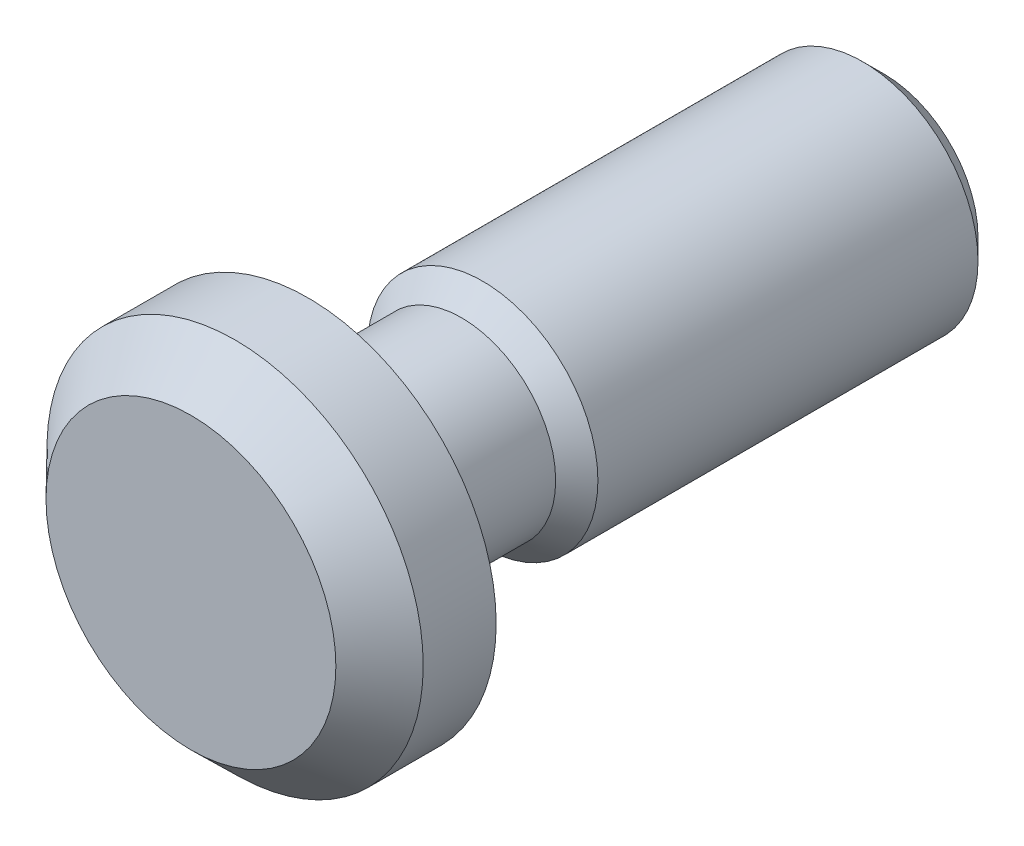
ISO-10303-21;
HEADER;
FILE_DESCRIPTION(('STEP AP214'),'2;1');
FILE_NAME('part.step','',(''),(''),'','','');
FILE_SCHEMA(('AUTOMOTIVE_DESIGN { 1 0 10303 214 1 1 1 1 }'));
ENDSEC;
DATA;
#1=APPLICATION_CONTEXT('core data for automotive mechanical design processes');
#2=APPLICATION_PROTOCOL_DEFINITION('international standard','automotive_design',2000,#1);
#3=PRODUCT_CONTEXT('',#1,'mechanical');
#4=PRODUCT('Part','Part','',(#3));
#5=PRODUCT_RELATED_PRODUCT_CATEGORY('part','',(#4));
#6=PRODUCT_DEFINITION_FORMATION('','',#4);
#7=PRODUCT_DEFINITION_CONTEXT('part definition',#1,'design');
#8=PRODUCT_DEFINITION('design','',#6,#7);
#9=PRODUCT_DEFINITION_SHAPE('','',#8);
#10=(LENGTH_UNIT() NAMED_UNIT(*) SI_UNIT(.MILLI.,.METRE.));
#11=(NAMED_UNIT(*) PLANE_ANGLE_UNIT() SI_UNIT($,.RADIAN.));
#12=(NAMED_UNIT(*) SI_UNIT($,.STERADIAN.) SOLID_ANGLE_UNIT());
#13=UNCERTAINTY_MEASURE_WITH_UNIT(LENGTH_MEASURE(1.E-05),#10,'distance_accuracy_value','');
#14=(GEOMETRIC_REPRESENTATION_CONTEXT(3) GLOBAL_UNCERTAINTY_ASSIGNED_CONTEXT((#13)) GLOBAL_UNIT_ASSIGNED_CONTEXT((#10,
#11,#12)) REPRESENTATION_CONTEXT('',''));
#15=CARTESIAN_POINT('',(0.,0.,0.));
#16=DIRECTION('',(0.,0.,1.));
#17=DIRECTION('',(1.,0.,0.));
#18=AXIS2_PLACEMENT_3D('',#15,#16,#17);
#19=CARTESIAN_POINT('',(0.,0.,6.1));
#20=DIRECTION('',(0.,0.,1.));
#21=DIRECTION('',(1.,0.,0.));
#22=AXIS2_PLACEMENT_3D('',#19,#20,#21);
#23=PLANE('',#22);
#24=CARTESIAN_POINT('',(0.,0.,6.1));
#25=DIRECTION('',(0.,0.,-1.));
#26=DIRECTION('',(0.,1.,0.));
#27=AXIS2_PLACEMENT_3D('',#24,#25,#26);
#28=CIRCLE('',#27,7.55000000000016);
#29=CARTESIAN_POINT('',(0.,7.55000000000016,6.1));
#30=VERTEX_POINT('',#29);
#31=EDGE_CURVE('E103',#30,#30,#28,.T.);
#32=ORIENTED_EDGE('',*,*,#31,.F.);
#33=EDGE_LOOP('',(#32));
#34=FACE_BOUND('',#33,.T.);
#35=ADVANCED_FACE('F16',(#34),#23,.T.);
#36=CARTESIAN_POINT('',(0.,0.,3.8));
#37=DIRECTION('',(0.,0.,-1.));
#38=DIRECTION('',(0.,1.,0.));
#39=AXIS2_PLACEMENT_3D('',#36,#37,#38);
#40=CONICAL_SURFACE('',#39,9.79999999999968,0.774409594714606);
#41=ORIENTED_EDGE('',*,*,#31,.T.);
#42=EDGE_LOOP('',(#41));
#43=FACE_BOUND('',#42,.T.);
#44=CARTESIAN_POINT('',(0.,0.,3.8));
#45=DIRECTION('',(0.,0.,1.));
#46=DIRECTION('',(1.,0.,0.));
#47=AXIS2_PLACEMENT_3D('',#44,#45,#46);
#48=CIRCLE('',#47,9.79999999999968);
#49=CARTESIAN_POINT('',(9.79999999999968,0.,3.8));
#50=VERTEX_POINT('',#49);
#51=EDGE_CURVE('E100',#50,#50,#48,.F.);
#52=ORIENTED_EDGE('',*,*,#51,.F.);
#53=EDGE_LOOP('',(#52));
#54=FACE_BOUND('',#53,.T.);
#55=ADVANCED_FACE('F112',(#43,#54),#40,.T.);
#56=CARTESIAN_POINT('',(0.,0.,-30.));
#57=DIRECTION('',(0.,0.,1.));
#58=DIRECTION('',(1.,0.,0.));
#59=AXIS2_PLACEMENT_3D('',#56,#57,#58);
#60=CYLINDRICAL_SURFACE('',#59,9.79999999999968);
#61=CARTESIAN_POINT('',(0.,0.,-3.32407712466676E-11));
#62=DIRECTION('',(0.,0.,1.));
#63=DIRECTION('',(1.,0.,0.));
#64=AXIS2_PLACEMENT_3D('',#61,#62,#63);
#65=CIRCLE('',#64,9.79999999999968);
#66=CARTESIAN_POINT('',(9.79999999999968,0.,-3.32407712466676E-11));
#67=VERTEX_POINT('',#66);
#68=EDGE_CURVE('E40',#67,#67,#65,.F.);
#69=ORIENTED_EDGE('',*,*,#68,.F.);
#70=EDGE_LOOP('',(#69));
#71=FACE_BOUND('',#70,.T.);
#72=ORIENTED_EDGE('',*,*,#51,.T.);
#73=EDGE_LOOP('',(#72));
#74=FACE_BOUND('',#73,.T.);
#75=ADVANCED_FACE('F110',(#71,#74),#60,.T.);
#76=CARTESIAN_POINT('',(9.79999999999968,0.,-3.32409880871021E-11));
#77=DIRECTION('',(0.,0.,-1.));
#78=DIRECTION('',(-1.,0.,0.));
#79=AXIS2_PLACEMENT_3D('',#76,#77,#78);
#80=PLANE('',#79);
#81=ORIENTED_EDGE('',*,*,#68,.T.);
#82=EDGE_LOOP('',(#81));
#83=FACE_BOUND('',#82,.T.);
#84=CARTESIAN_POINT('',(0.,0.,-3.32408796668848E-11));
#85=DIRECTION('',(0.,0.,-1.));
#86=DIRECTION('',(-1.,0.,0.));
#87=AXIS2_PLACEMENT_3D('',#84,#85,#86);
#88=CIRCLE('',#87,5.64999999995103);
#89=CARTESIAN_POINT('',(5.64999999995103,0.,-3.32409230349717E-11));
#90=VERTEX_POINT('',#89);
#91=CARTESIAN_POINT('',(-5.64999999995103,0.,-3.32409230349717E-11));
#92=VERTEX_POINT('',#91);
#93=EDGE_CURVE('E33',#90,#92,#88,.F.);
#94=ORIENTED_EDGE('',*,*,#93,.T.);
#95=CARTESIAN_POINT('',(0.,0.,-3.32408796668848E-11));
#96=DIRECTION('',(0.,0.,-1.));
#97=DIRECTION('',(1.,0.,0.));
#98=AXIS2_PLACEMENT_3D('',#95,#96,#97);
#99=CIRCLE('',#98,5.64999999995103);
#100=EDGE_CURVE('E36',#92,#90,#99,.F.);
#101=ORIENTED_EDGE('',*,*,#100,.T.);
#102=EDGE_LOOP('',(#94,#101));
#103=FACE_BOUND('',#102,.T.);
#104=ADVANCED_FACE('F38',(#83,#103),#80,.T.);
#105=CARTESIAN_POINT('',(0.,0.,-0.750000000033241));
#106=DIRECTION('',(0.,0.,1.));
#107=DIRECTION('',(1.,0.,0.));
#108=AXIS2_PLACEMENT_3D('',#105,#106,#107);
#109=TOROIDAL_SURFACE('',#108,5.64999999995103,0.75);
#110=ORIENTED_EDGE('',*,*,#93,.F.);
#111=ORIENTED_EDGE('',*,*,#100,.F.);
#112=EDGE_LOOP('',(#110,#111));
#113=FACE_BOUND('',#112,.T.);
#114=CARTESIAN_POINT('',(0.,0.,-0.750000000033241));
#115=DIRECTION('',(0.,0.,1.));
#116=DIRECTION('',(1.,0.,0.));
#117=AXIS2_PLACEMENT_3D('',#114,#115,#116);
#118=CIRCLE('',#117,4.89999999995103);
#119=CARTESIAN_POINT('',(4.89999999995103,0.,-0.750000000033241));
#120=VERTEX_POINT('',#119);
#121=EDGE_CURVE('E46',#120,#120,#118,.F.);
#122=ORIENTED_EDGE('',*,*,#121,.F.);
#123=EDGE_LOOP('',(#122));
#124=FACE_BOUND('',#123,.T.);
#125=ADVANCED_FACE('F44',(#113,#124),#109,.F.);
#126=CARTESIAN_POINT('',(4.89999999996371,0.,-30.));
#127=DIRECTION('',(0.,0.,-1.));
#128=DIRECTION('',(-1.,0.,0.));
#129=AXIS2_PLACEMENT_3D('',#126,#127,#128);
#130=PLANE('',#129);
#131=CARTESIAN_POINT('',(0.,0.,-29.9999999999159));
#132=DIRECTION('',(0.,0.,1.));
#133=DIRECTION('',(1.,0.,0.));
#134=AXIS2_PLACEMENT_3D('',#131,#132,#133);
#135=CIRCLE('',#134,4.89999999996371);
#136=CARTESIAN_POINT('',(4.89999999996371,0.,-29.9999999999159));
#137=VERTEX_POINT('',#136);
#138=EDGE_CURVE('E81',#137,#137,#135,.T.);
#139=ORIENTED_EDGE('',*,*,#138,.F.);
#140=EDGE_LOOP('',(#139));
#141=FACE_BOUND('',#140,.T.);
#142=ADVANCED_FACE('F64',(#141),#130,.T.);
#143=CARTESIAN_POINT('',(0.,0.,-30.));
#144=DIRECTION('',(0.,0.,1.));
#145=DIRECTION('',(1.,0.,0.));
#146=AXIS2_PLACEMENT_3D('',#143,#144,#145);
#147=CYLINDRICAL_SURFACE('',#146,4.89999999995103);
#148=ORIENTED_EDGE('',*,*,#121,.T.);
#149=EDGE_LOOP('',(#148));
#150=FACE_BOUND('',#149,.T.);
#151=CARTESIAN_POINT('',(0.,0.,-8.00000000009504));
#152=DIRECTION('',(0.,0.,-1.));
#153=DIRECTION('',(-1.,0.,0.));
#154=AXIS2_PLACEMENT_3D('',#151,#152,#153);
#155=CIRCLE('',#154,4.89999999996371);
#156=CARTESIAN_POINT('',(-4.89999999996371,0.,-8.00000000009504));
#157=VERTEX_POINT('',#156);
#158=EDGE_CURVE('E71',#157,#157,#155,.T.);
#159=ORIENTED_EDGE('',*,*,#158,.F.);
#160=EDGE_LOOP('',(#159));
#161=FACE_BOUND('',#160,.T.);
#162=ADVANCED_FACE('F91',(#150,#161),#147,.T.);
#163=CARTESIAN_POINT('',(0.,0.,-28.8999999999646));
#164=DIRECTION('',(0.,0.,1.));
#165=DIRECTION('',(1.,0.,0.));
#166=AXIS2_PLACEMENT_3D('',#163,#164,#165);
#167=CONICAL_SURFACE('',#166,5.99999999991496,0.785398163397448);
#168=CARTESIAN_POINT('',(0.,0.,-28.9000000000421));
#169=DIRECTION('',(0.,0.,1.));
#170=DIRECTION('',(1.,0.,0.));
#171=AXIS2_PLACEMENT_3D('',#168,#169,#170);
#172=CIRCLE('',#171,5.99999999992165);
#173=CARTESIAN_POINT('',(5.99999999992165,0.,-28.9000000000421));
#174=VERTEX_POINT('',#173);
#175=EDGE_CURVE('E26',#174,#174,#172,.T.);
#176=ORIENTED_EDGE('',*,*,#175,.F.);
#177=EDGE_LOOP('',(#176));
#178=FACE_BOUND('',#177,.T.);
#179=ORIENTED_EDGE('',*,*,#138,.T.);
#180=EDGE_LOOP('',(#179));
#181=FACE_BOUND('',#180,.T.);
#182=ADVANCED_FACE('F87',(#178,#181),#167,.T.);
#183=CARTESIAN_POINT('',(0.,0.,-9.09999999993261));
#184=DIRECTION('',(0.,0.,-1.));
#185=DIRECTION('',(-1.,0.,0.));
#186=AXIS2_PLACEMENT_3D('',#183,#184,#185);
#187=CONICAL_SURFACE('',#186,5.99999999985812,0.785398163397448);
#188=CARTESIAN_POINT('',(0.,0.,-9.10000000004206));
#189=DIRECTION('',(0.,0.,1.));
#190=DIRECTION('',(1.,0.,0.));
#191=AXIS2_PLACEMENT_3D('',#188,#189,#190);
#192=CIRCLE('',#191,5.99999999992165);
#193=CARTESIAN_POINT('',(5.99999999992165,0.,-9.10000000004206));
#194=VERTEX_POINT('',#193);
#195=EDGE_CURVE('E11',#194,#194,#192,.F.);
#196=ORIENTED_EDGE('',*,*,#195,.F.);
#197=EDGE_LOOP('',(#196));
#198=FACE_BOUND('',#197,.T.);
#199=ORIENTED_EDGE('',*,*,#158,.T.);
#200=EDGE_LOOP('',(#199));
#201=FACE_BOUND('',#200,.T.);
#202=ADVANCED_FACE('F90',(#198,#201),#187,.T.);
#203=CARTESIAN_POINT('',(0.,0.,-30.));
#204=DIRECTION('',(0.,0.,1.));
#205=DIRECTION('',(1.,0.,0.));
#206=AXIS2_PLACEMENT_3D('',#203,#204,#205);
#207=CYLINDRICAL_SURFACE('',#206,5.99999999992165);
#208=ORIENTED_EDGE('',*,*,#195,.T.);
#209=EDGE_LOOP('',(#208));
#210=FACE_BOUND('',#209,.T.);
#211=ORIENTED_EDGE('',*,*,#175,.T.);
#212=EDGE_LOOP('',(#211));
#213=FACE_BOUND('',#212,.T.);
#214=ADVANCED_FACE('F85',(#210,#213),#207,.T.);
#215=CLOSED_SHELL('',(#35,#55,#75,#104,#125,#142,#162,#182,#202,#214));
#216=MANIFOLD_SOLID_BREP('B1',#215);
#217=ADVANCED_BREP_SHAPE_REPRESENTATION('',(#18,#216),#14);
#218=SHAPE_DEFINITION_REPRESENTATION(#9,#217);
ENDSEC;
END-ISO-10303-21;
